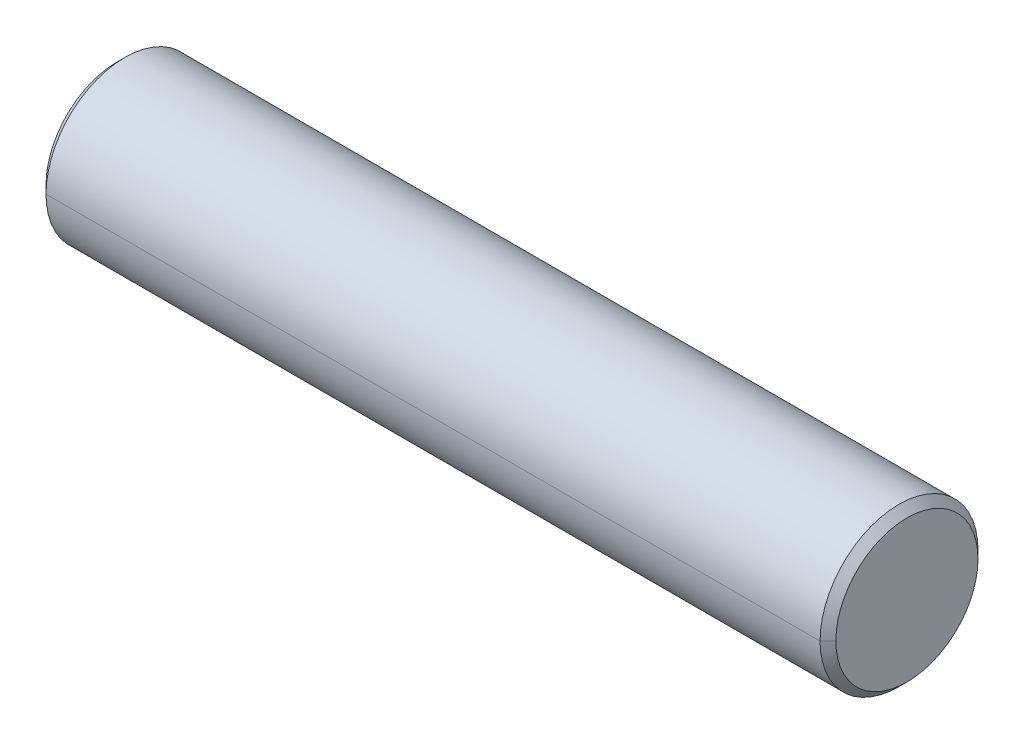
ISO-10303-21;
HEADER;
FILE_DESCRIPTION(('STEP AP214'),'2;1');
FILE_NAME('part.step','',(''),(''),'','','');
FILE_SCHEMA(('AUTOMOTIVE_DESIGN { 1 0 10303 214 1 1 1 1 }'));
ENDSEC;
DATA;
#1=APPLICATION_CONTEXT('core data for automotive mechanical design processes');
#2=APPLICATION_PROTOCOL_DEFINITION('international standard','automotive_design',2000,#1);
#3=PRODUCT_CONTEXT('',#1,'mechanical');
#4=PRODUCT('Part','Part','',(#3));
#5=PRODUCT_RELATED_PRODUCT_CATEGORY('part','',(#4));
#6=PRODUCT_DEFINITION_FORMATION('','',#4);
#7=PRODUCT_DEFINITION_CONTEXT('part definition',#1,'design');
#8=PRODUCT_DEFINITION('design','',#6,#7);
#9=PRODUCT_DEFINITION_SHAPE('','',#8);
#10=(LENGTH_UNIT() NAMED_UNIT(*) SI_UNIT(.MILLI.,.METRE.));
#11=(NAMED_UNIT(*) PLANE_ANGLE_UNIT() SI_UNIT($,.RADIAN.));
#12=(NAMED_UNIT(*) SI_UNIT($,.STERADIAN.) SOLID_ANGLE_UNIT());
#13=UNCERTAINTY_MEASURE_WITH_UNIT(LENGTH_MEASURE(1.E-05),#10,'distance_accuracy_value','');
#14=(GEOMETRIC_REPRESENTATION_CONTEXT(3) GLOBAL_UNCERTAINTY_ASSIGNED_CONTEXT((#13)) GLOBAL_UNIT_ASSIGNED_CONTEXT((#10,
#11,#12)) REPRESENTATION_CONTEXT('',''));
#15=CARTESIAN_POINT('',(0.,0.,0.));
#16=DIRECTION('',(0.,0.,1.));
#17=DIRECTION('',(1.,0.,0.));
#18=AXIS2_PLACEMENT_3D('',#15,#16,#17);
#19=CARTESIAN_POINT('',(10.,0.,0.));
#20=DIRECTION('',(-1.,0.,0.));
#21=DIRECTION('',(0.,0.,1.));
#22=AXIS2_PLACEMENT_3D('',#19,#20,#21);
#23=CONICAL_SURFACE('',#22,1.8,0.785398163397448);
#24=DIRECTION('',(-0.707106781186548,0.,-0.707106781186548));
#25=VECTOR('',#24,1.);
#26=CARTESIAN_POINT('',(10.,0.,-1.8));
#27=LINE('',#26,#25);
#28=CARTESIAN_POINT('',(10.,0.,-1.8));
#29=VERTEX_POINT('',#28);
#30=CARTESIAN_POINT('',(9.8,0.,-2.));
#31=VERTEX_POINT('',#30);
#32=EDGE_CURVE('E82',#29,#31,#27,.T.);
#33=ORIENTED_EDGE('',*,*,#32,.F.);
#34=CARTESIAN_POINT('',(10.,0.,0.));
#35=DIRECTION('',(1.,0.,0.));
#36=DIRECTION('',(0.,0.,-1.));
#37=AXIS2_PLACEMENT_3D('',#34,#35,#36);
#38=CIRCLE('',#37,1.8);
#39=CARTESIAN_POINT('',(10.,0.,1.8));
#40=VERTEX_POINT('',#39);
#41=EDGE_CURVE('E28',#40,#29,#38,.T.);
#42=ORIENTED_EDGE('',*,*,#41,.F.);
#43=DIRECTION('',(-0.707106781186548,0.,0.707106781186548));
#44=VECTOR('',#43,1.);
#45=CARTESIAN_POINT('',(10.,0.,1.8));
#46=LINE('',#45,#44);
#47=CARTESIAN_POINT('',(9.8,0.,2.));
#48=VERTEX_POINT('',#47);
#49=EDGE_CURVE('E21',#40,#48,#46,.T.);
#50=ORIENTED_EDGE('',*,*,#49,.T.);
#51=CARTESIAN_POINT('',(9.8,0.,0.));
#52=DIRECTION('',(-1.,0.,0.));
#53=DIRECTION('',(0.,0.,-1.));
#54=AXIS2_PLACEMENT_3D('',#51,#52,#53);
#55=CIRCLE('',#54,2.);
#56=EDGE_CURVE('E83',#31,#48,#55,.T.);
#57=ORIENTED_EDGE('',*,*,#56,.F.);
#58=EDGE_LOOP('',(#33,#42,#50,#57));
#59=FACE_BOUND('',#58,.T.);
#60=ADVANCED_FACE('F17',(#59),#23,.T.);
#61=CARTESIAN_POINT('',(-9.8,0.,0.));
#62=DIRECTION('',(1.,0.,0.));
#63=DIRECTION('',(0.,0.,-1.));
#64=AXIS2_PLACEMENT_3D('',#61,#62,#63);
#65=CONICAL_SURFACE('',#64,2.,0.78539816339744);
#66=DIRECTION('',(0.707106781186554,0.,0.707106781186542));
#67=VECTOR('',#66,1.);
#68=CARTESIAN_POINT('',(-9.8,0.,2.));
#69=LINE('',#68,#67);
#70=CARTESIAN_POINT('',(-10.,0.,1.8));
#71=VERTEX_POINT('',#70);
#72=CARTESIAN_POINT('',(-9.8,0.,2.));
#73=VERTEX_POINT('',#72);
#74=EDGE_CURVE('E101',#71,#73,#69,.T.);
#75=ORIENTED_EDGE('',*,*,#74,.F.);
#76=CARTESIAN_POINT('',(-10.,0.,0.));
#77=DIRECTION('',(-1.,0.,0.));
#78=DIRECTION('',(0.,0.,-1.));
#79=AXIS2_PLACEMENT_3D('',#76,#77,#78);
#80=CIRCLE('',#79,1.8);
#81=CARTESIAN_POINT('',(-10.,0.,-1.8));
#82=VERTEX_POINT('',#81);
#83=EDGE_CURVE('E11',#82,#71,#80,.T.);
#84=ORIENTED_EDGE('',*,*,#83,.F.);
#85=DIRECTION('',(0.707106781186554,0.,-0.707106781186542));
#86=VECTOR('',#85,1.);
#87=CARTESIAN_POINT('',(-9.8,0.,-2.));
#88=LINE('',#87,#86);
#89=CARTESIAN_POINT('',(-9.8,0.,-2.));
#90=VERTEX_POINT('',#89);
#91=EDGE_CURVE('E100',#82,#90,#88,.T.);
#92=ORIENTED_EDGE('',*,*,#91,.T.);
#93=CARTESIAN_POINT('',(-9.8,0.,0.));
#94=DIRECTION('',(1.,0.,0.));
#95=DIRECTION('',(0.,0.,-1.));
#96=AXIS2_PLACEMENT_3D('',#93,#94,#95);
#97=CIRCLE('',#96,2.);
#98=EDGE_CURVE('E43',#73,#90,#97,.T.);
#99=ORIENTED_EDGE('',*,*,#98,.F.);
#100=EDGE_LOOP('',(#75,#84,#92,#99));
#101=FACE_BOUND('',#100,.T.);
#102=ADVANCED_FACE('F19',(#101),#65,.T.);
#103=CARTESIAN_POINT('',(-10.,0.,0.));
#104=DIRECTION('',(1.,0.,0.));
#105=DIRECTION('',(0.,1.,0.));
#106=AXIS2_PLACEMENT_3D('',#103,#104,#105);
#107=PLANE('',#106);
#108=ORIENTED_EDGE('',*,*,#83,.T.);
#109=CARTESIAN_POINT('',(-10.,0.,0.));
#110=DIRECTION('',(-1.,0.,0.));
#111=DIRECTION('',(0.,0.,-1.));
#112=AXIS2_PLACEMENT_3D('',#109,#110,#111);
#113=CIRCLE('',#112,1.8);
#114=EDGE_CURVE('E96',#71,#82,#113,.T.);
#115=ORIENTED_EDGE('',*,*,#114,.T.);
#116=EDGE_LOOP('',(#108,#115));
#117=FACE_BOUND('',#116,.T.);
#118=ADVANCED_FACE('F144',(#117),#107,.F.);
#119=CARTESIAN_POINT('',(10.,0.,0.));
#120=DIRECTION('',(1.,0.,0.));
#121=DIRECTION('',(0.,1.,0.));
#122=AXIS2_PLACEMENT_3D('',#119,#120,#121);
#123=PLANE('',#122);
#124=ORIENTED_EDGE('',*,*,#41,.T.);
#125=CARTESIAN_POINT('',(10.,0.,0.));
#126=DIRECTION('',(1.,0.,0.));
#127=DIRECTION('',(0.,0.,-1.));
#128=AXIS2_PLACEMENT_3D('',#125,#126,#127);
#129=CIRCLE('',#128,1.8);
#130=EDGE_CURVE('E78',#29,#40,#129,.T.);
#131=ORIENTED_EDGE('',*,*,#130,.T.);
#132=EDGE_LOOP('',(#124,#131));
#133=FACE_BOUND('',#132,.T.);
#134=ADVANCED_FACE('F76',(#133),#123,.T.);
#135=CARTESIAN_POINT('',(10.,0.,0.));
#136=DIRECTION('',(-1.,0.,0.));
#137=DIRECTION('',(0.,0.,1.));
#138=AXIS2_PLACEMENT_3D('',#135,#136,#137);
#139=CYLINDRICAL_SURFACE('',#138,2.);
#140=DIRECTION('',(-1.,0.,0.));
#141=VECTOR('',#140,1.);
#142=CARTESIAN_POINT('',(10.,0.,-2.));
#143=LINE('',#142,#141);
#144=EDGE_CURVE('E103',#31,#90,#143,.T.);
#145=ORIENTED_EDGE('',*,*,#144,.F.);
#146=ORIENTED_EDGE('',*,*,#56,.T.);
#147=DIRECTION('',(-1.,0.,0.));
#148=VECTOR('',#147,1.);
#149=CARTESIAN_POINT('',(10.,0.,2.));
#150=LINE('',#149,#148);
#151=EDGE_CURVE('E106',#48,#73,#150,.T.);
#152=ORIENTED_EDGE('',*,*,#151,.T.);
#153=ORIENTED_EDGE('',*,*,#98,.T.);
#154=EDGE_LOOP('',(#145,#146,#152,#153));
#155=FACE_BOUND('',#154,.T.);
#156=ADVANCED_FACE('F134',(#155),#139,.T.);
#157=CARTESIAN_POINT('',(10.,0.,0.));
#158=DIRECTION('',(-1.,0.,0.));
#159=DIRECTION('',(0.,0.,1.));
#160=AXIS2_PLACEMENT_3D('',#157,#158,#159);
#161=CYLINDRICAL_SURFACE('',#160,2.);
#162=CARTESIAN_POINT('',(9.8,0.,0.));
#163=DIRECTION('',(-1.,0.,0.));
#164=DIRECTION('',(0.,0.,-1.));
#165=AXIS2_PLACEMENT_3D('',#162,#163,#164);
#166=CIRCLE('',#165,2.);
#167=EDGE_CURVE('E87',#48,#31,#166,.T.);
#168=ORIENTED_EDGE('',*,*,#167,.T.);
#169=ORIENTED_EDGE('',*,*,#144,.T.);
#170=CARTESIAN_POINT('',(-9.8,0.,0.));
#171=DIRECTION('',(1.,0.,0.));
#172=DIRECTION('',(0.,0.,-1.));
#173=AXIS2_PLACEMENT_3D('',#170,#171,#172);
#174=CIRCLE('',#173,2.);
#175=EDGE_CURVE('E97',#90,#73,#174,.T.);
#176=ORIENTED_EDGE('',*,*,#175,.T.);
#177=ORIENTED_EDGE('',*,*,#151,.F.);
#178=EDGE_LOOP('',(#168,#169,#176,#177));
#179=FACE_BOUND('',#178,.T.);
#180=ADVANCED_FACE('F133',(#179),#161,.T.);
#181=CARTESIAN_POINT('',(-9.8,0.,0.));
#182=DIRECTION('',(1.,0.,0.));
#183=DIRECTION('',(0.,0.,-1.));
#184=AXIS2_PLACEMENT_3D('',#181,#182,#183);
#185=CONICAL_SURFACE('',#184,2.,0.78539816339744);
#186=ORIENTED_EDGE('',*,*,#114,.F.);
#187=ORIENTED_EDGE('',*,*,#74,.T.);
#188=ORIENTED_EDGE('',*,*,#175,.F.);
#189=ORIENTED_EDGE('',*,*,#91,.F.);
#190=EDGE_LOOP('',(#186,#187,#188,#189));
#191=FACE_BOUND('',#190,.T.);
#192=ADVANCED_FACE('F142',(#191),#185,.T.);
#193=CARTESIAN_POINT('',(10.,0.,0.));
#194=DIRECTION('',(-1.,0.,0.));
#195=DIRECTION('',(0.,0.,1.));
#196=AXIS2_PLACEMENT_3D('',#193,#194,#195);
#197=CONICAL_SURFACE('',#196,1.8,0.785398163397448);
#198=ORIENTED_EDGE('',*,*,#130,.F.);
#199=ORIENTED_EDGE('',*,*,#32,.T.);
#200=ORIENTED_EDGE('',*,*,#167,.F.);
#201=ORIENTED_EDGE('',*,*,#49,.F.);
#202=EDGE_LOOP('',(#198,#199,#200,#201));
#203=FACE_BOUND('',#202,.T.);
#204=ADVANCED_FACE('F89',(#203),#197,.T.);
#205=CLOSED_SHELL('',(#60,#102,#118,#134,#156,#180,#192,#204));
#206=MANIFOLD_SOLID_BREP('B1',#205);
#207=ADVANCED_BREP_SHAPE_REPRESENTATION('',(#18,#206),#14);
#208=SHAPE_DEFINITION_REPRESENTATION(#9,#207);
ENDSEC;
END-ISO-10303-21;
